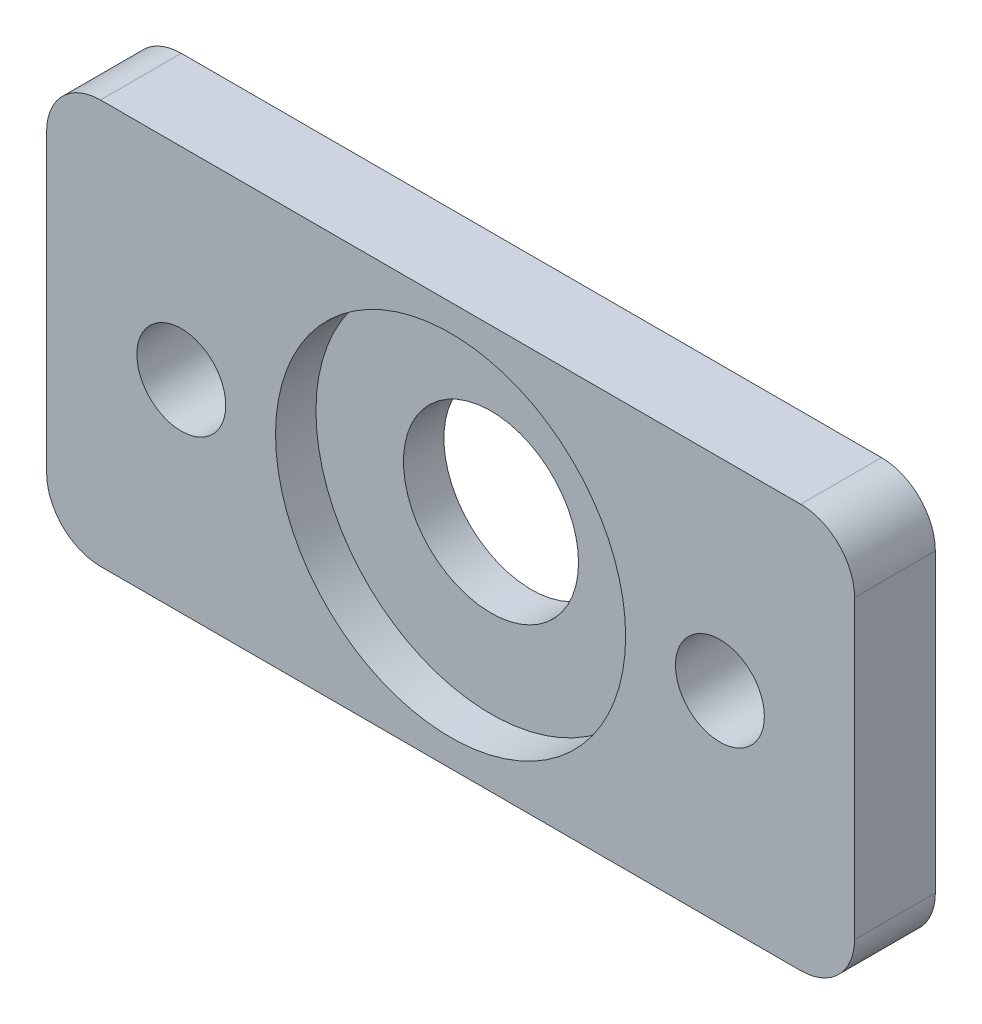
ISO-10303-21;
HEADER;
FILE_DESCRIPTION(('STEP AP214'),'2;1');
FILE_NAME('part.step','',(''),(''),'','','');
FILE_SCHEMA(('AUTOMOTIVE_DESIGN { 1 0 10303 214 1 1 1 1 }'));
ENDSEC;
DATA;
#1=APPLICATION_CONTEXT('core data for automotive mechanical design processes');
#2=APPLICATION_PROTOCOL_DEFINITION('international standard','automotive_design',2000,#1);
#3=PRODUCT_CONTEXT('',#1,'mechanical');
#4=PRODUCT('Part','Part','',(#3));
#5=PRODUCT_RELATED_PRODUCT_CATEGORY('part','',(#4));
#6=PRODUCT_DEFINITION_FORMATION('','',#4);
#7=PRODUCT_DEFINITION_CONTEXT('part definition',#1,'design');
#8=PRODUCT_DEFINITION('design','',#6,#7);
#9=PRODUCT_DEFINITION_SHAPE('','',#8);
#10=(LENGTH_UNIT() NAMED_UNIT(*) SI_UNIT(.MILLI.,.METRE.));
#11=(NAMED_UNIT(*) PLANE_ANGLE_UNIT() SI_UNIT($,.RADIAN.));
#12=(NAMED_UNIT(*) SI_UNIT($,.STERADIAN.) SOLID_ANGLE_UNIT());
#13=UNCERTAINTY_MEASURE_WITH_UNIT(LENGTH_MEASURE(1.E-05),#10,'distance_accuracy_value','');
#14=(GEOMETRIC_REPRESENTATION_CONTEXT(3) GLOBAL_UNCERTAINTY_ASSIGNED_CONTEXT((#13)) GLOBAL_UNIT_ASSIGNED_CONTEXT((#10,
#11,#12)) REPRESENTATION_CONTEXT('',''));
#15=CARTESIAN_POINT('',(0.,0.,0.));
#16=DIRECTION('',(0.,0.,1.));
#17=DIRECTION('',(1.,0.,0.));
#18=AXIS2_PLACEMENT_3D('',#15,#16,#17);
#19=CARTESIAN_POINT('',(28.,13.,3.));
#20=DIRECTION('',(0.,0.,-1.));
#21=DIRECTION('',(-1.,0.,0.));
#22=AXIS2_PLACEMENT_3D('',#19,#20,#21);
#23=CYLINDRICAL_SURFACE('',#22,2.);
#24=CARTESIAN_POINT('',(28.,13.,0.));
#25=DIRECTION('',(0.,0.,1.));
#26=DIRECTION('',(-1.,0.,0.));
#27=AXIS2_PLACEMENT_3D('',#24,#25,#26);
#28=CIRCLE('',#27,2.);
#29=CARTESIAN_POINT('',(30.,13.,0.));
#30=VERTEX_POINT('',#29);
#31=CARTESIAN_POINT('',(28.,15.,0.));
#32=VERTEX_POINT('',#31);
#33=EDGE_CURVE('E132',#30,#32,#28,.T.);
#34=ORIENTED_EDGE('',*,*,#33,.T.);
#35=DIRECTION('',(0.,0.,-1.));
#36=VECTOR('',#35,1.);
#37=CARTESIAN_POINT('',(28.,15.,3.));
#38=LINE('',#37,#36);
#39=CARTESIAN_POINT('',(28.,15.,3.));
#40=VERTEX_POINT('',#39);
#41=EDGE_CURVE('E11',#40,#32,#38,.T.);
#42=ORIENTED_EDGE('',*,*,#41,.F.);
#43=CARTESIAN_POINT('',(28.,13.,3.));
#44=DIRECTION('',(0.,0.,1.));
#45=DIRECTION('',(-1.,0.,0.));
#46=AXIS2_PLACEMENT_3D('',#43,#44,#45);
#47=CIRCLE('',#46,2.);
#48=CARTESIAN_POINT('',(30.,13.,3.));
#49=VERTEX_POINT('',#48);
#50=EDGE_CURVE('E147',#49,#40,#47,.T.);
#51=ORIENTED_EDGE('',*,*,#50,.F.);
#52=DIRECTION('',(0.,0.,-1.));
#53=VECTOR('',#52,1.);
#54=CARTESIAN_POINT('',(30.,13.,3.));
#55=LINE('',#54,#53);
#56=EDGE_CURVE('E128',#49,#30,#55,.T.);
#57=ORIENTED_EDGE('',*,*,#56,.T.);
#58=EDGE_LOOP('',(#34,#42,#51,#57));
#59=FACE_BOUND('',#58,.T.);
#60=ADVANCED_FACE('F35',(#59),#23,.T.);
#61=CARTESIAN_POINT('',(2.00000000000001,15.,3.));
#62=DIRECTION('',(0.,-1.,0.));
#63=DIRECTION('',(0.,0.,-1.));
#64=AXIS2_PLACEMENT_3D('',#61,#62,#63);
#65=PLANE('',#64);
#66=DIRECTION('',(-1.,0.,0.));
#67=VECTOR('',#66,1.);
#68=CARTESIAN_POINT('',(2.00000000000001,15.,0.));
#69=LINE('',#68,#67);
#70=CARTESIAN_POINT('',(2.00000000000001,15.,0.));
#71=VERTEX_POINT('',#70);
#72=EDGE_CURVE('E135',#32,#71,#69,.T.);
#73=ORIENTED_EDGE('',*,*,#72,.T.);
#74=DIRECTION('',(0.,0.,-1.));
#75=VECTOR('',#74,1.);
#76=CARTESIAN_POINT('',(2.00000000000001,15.,3.));
#77=LINE('',#76,#75);
#78=CARTESIAN_POINT('',(2.00000000000001,15.,3.));
#79=VERTEX_POINT('',#78);
#80=EDGE_CURVE('E44',#79,#71,#77,.T.);
#81=ORIENTED_EDGE('',*,*,#80,.F.);
#82=DIRECTION('',(-1.,0.,0.));
#83=VECTOR('',#82,1.);
#84=CARTESIAN_POINT('',(2.00000000000001,15.,3.));
#85=LINE('',#84,#83);
#86=EDGE_CURVE('E95',#40,#79,#85,.T.);
#87=ORIENTED_EDGE('',*,*,#86,.F.);
#88=ORIENTED_EDGE('',*,*,#41,.T.);
#89=EDGE_LOOP('',(#73,#81,#87,#88));
#90=FACE_BOUND('',#89,.T.);
#91=ADVANCED_FACE('F234',(#90),#65,.F.);
#92=CARTESIAN_POINT('',(2.,13.,3.));
#93=DIRECTION('',(0.,0.,-1.));
#94=DIRECTION('',(-1.,0.,0.));
#95=AXIS2_PLACEMENT_3D('',#92,#93,#94);
#96=CYLINDRICAL_SURFACE('',#95,2.);
#97=CARTESIAN_POINT('',(2.,13.,0.));
#98=DIRECTION('',(0.,0.,1.));
#99=DIRECTION('',(-1.,0.,0.));
#100=AXIS2_PLACEMENT_3D('',#97,#98,#99);
#101=CIRCLE('',#100,2.);
#102=CARTESIAN_POINT('',(0.,13.,0.));
#103=VERTEX_POINT('',#102);
#104=EDGE_CURVE('E138',#71,#103,#101,.T.);
#105=ORIENTED_EDGE('',*,*,#104,.T.);
#106=DIRECTION('',(0.,0.,-1.));
#107=VECTOR('',#106,1.);
#108=CARTESIAN_POINT('',(0.,13.,3.));
#109=LINE('',#108,#107);
#110=CARTESIAN_POINT('',(0.,13.,3.));
#111=VERTEX_POINT('',#110);
#112=EDGE_CURVE('E154',#111,#103,#109,.T.);
#113=ORIENTED_EDGE('',*,*,#112,.F.);
#114=CARTESIAN_POINT('',(2.,13.,3.));
#115=DIRECTION('',(0.,0.,1.));
#116=DIRECTION('',(-1.,0.,0.));
#117=AXIS2_PLACEMENT_3D('',#114,#115,#116);
#118=CIRCLE('',#117,2.);
#119=EDGE_CURVE('E163',#79,#111,#118,.T.);
#120=ORIENTED_EDGE('',*,*,#119,.F.);
#121=ORIENTED_EDGE('',*,*,#80,.T.);
#122=EDGE_LOOP('',(#105,#113,#120,#121));
#123=FACE_BOUND('',#122,.T.);
#124=ADVANCED_FACE('F161',(#123),#96,.T.);
#125=CARTESIAN_POINT('',(0.,2.00000000000001,3.));
#126=DIRECTION('',(1.,0.,0.));
#127=DIRECTION('',(0.,0.,-1.));
#128=AXIS2_PLACEMENT_3D('',#125,#126,#127);
#129=PLANE('',#128);
#130=DIRECTION('',(0.,-1.,0.));
#131=VECTOR('',#130,1.);
#132=CARTESIAN_POINT('',(0.,2.00000000000001,0.));
#133=LINE('',#132,#131);
#134=CARTESIAN_POINT('',(0.,2.00000000000001,0.));
#135=VERTEX_POINT('',#134);
#136=EDGE_CURVE('E140',#103,#135,#133,.T.);
#137=ORIENTED_EDGE('',*,*,#136,.T.);
#138=DIRECTION('',(0.,0.,-1.));
#139=VECTOR('',#138,1.);
#140=CARTESIAN_POINT('',(0.,2.00000000000001,3.));
#141=LINE('',#140,#139);
#142=CARTESIAN_POINT('',(0.,2.00000000000001,3.));
#143=VERTEX_POINT('',#142);
#144=EDGE_CURVE('E151',#143,#135,#141,.T.);
#145=ORIENTED_EDGE('',*,*,#144,.F.);
#146=DIRECTION('',(0.,-1.,0.));
#147=VECTOR('',#146,1.);
#148=CARTESIAN_POINT('',(0.,2.00000000000001,3.));
#149=LINE('',#148,#147);
#150=EDGE_CURVE('E175',#111,#143,#149,.T.);
#151=ORIENTED_EDGE('',*,*,#150,.F.);
#152=ORIENTED_EDGE('',*,*,#112,.T.);
#153=EDGE_LOOP('',(#137,#145,#151,#152));
#154=FACE_BOUND('',#153,.T.);
#155=ADVANCED_FACE('F171',(#154),#129,.F.);
#156=CARTESIAN_POINT('',(2.,2.,3.));
#157=DIRECTION('',(0.,0.,-1.));
#158=DIRECTION('',(-1.,0.,0.));
#159=AXIS2_PLACEMENT_3D('',#156,#157,#158);
#160=CYLINDRICAL_SURFACE('',#159,2.);
#161=CARTESIAN_POINT('',(2.,2.,0.));
#162=DIRECTION('',(0.,0.,1.));
#163=DIRECTION('',(-1.,0.,0.));
#164=AXIS2_PLACEMENT_3D('',#161,#162,#163);
#165=CIRCLE('',#164,2.);
#166=CARTESIAN_POINT('',(2.00000000000001,0.,0.));
#167=VERTEX_POINT('',#166);
#168=EDGE_CURVE('E142',#135,#167,#165,.T.);
#169=ORIENTED_EDGE('',*,*,#168,.T.);
#170=DIRECTION('',(0.,0.,-1.));
#171=VECTOR('',#170,1.);
#172=CARTESIAN_POINT('',(2.00000000000001,0.,3.));
#173=LINE('',#172,#171);
#174=CARTESIAN_POINT('',(2.00000000000001,0.,3.));
#175=VERTEX_POINT('',#174);
#176=EDGE_CURVE('E123',#175,#167,#173,.T.);
#177=ORIENTED_EDGE('',*,*,#176,.F.);
#178=CARTESIAN_POINT('',(2.,2.,3.));
#179=DIRECTION('',(0.,0.,1.));
#180=DIRECTION('',(-1.,0.,0.));
#181=AXIS2_PLACEMENT_3D('',#178,#179,#180);
#182=CIRCLE('',#181,2.);
#183=EDGE_CURVE('E114',#143,#175,#182,.T.);
#184=ORIENTED_EDGE('',*,*,#183,.F.);
#185=ORIENTED_EDGE('',*,*,#144,.T.);
#186=EDGE_LOOP('',(#169,#177,#184,#185));
#187=FACE_BOUND('',#186,.T.);
#188=ADVANCED_FACE('F174',(#187),#160,.T.);
#189=CARTESIAN_POINT('',(2.00000000000001,0.,3.));
#190=DIRECTION('',(0.,1.,0.));
#191=DIRECTION('',(0.,0.,1.));
#192=AXIS2_PLACEMENT_3D('',#189,#190,#191);
#193=PLANE('',#192);
#194=DIRECTION('',(1.,0.,0.));
#195=VECTOR('',#194,1.);
#196=CARTESIAN_POINT('',(2.00000000000001,0.,0.));
#197=LINE('',#196,#195);
#198=CARTESIAN_POINT('',(28.,0.,0.));
#199=VERTEX_POINT('',#198);
#200=EDGE_CURVE('E122',#167,#199,#197,.T.);
#201=ORIENTED_EDGE('',*,*,#200,.T.);
#202=DIRECTION('',(0.,0.,-1.));
#203=VECTOR('',#202,1.);
#204=CARTESIAN_POINT('',(28.,0.,3.));
#205=LINE('',#204,#203);
#206=CARTESIAN_POINT('',(28.,0.,3.));
#207=VERTEX_POINT('',#206);
#208=EDGE_CURVE('E119',#207,#199,#205,.T.);
#209=ORIENTED_EDGE('',*,*,#208,.F.);
#210=DIRECTION('',(1.,0.,0.));
#211=VECTOR('',#210,1.);
#212=CARTESIAN_POINT('',(2.00000000000001,0.,3.));
#213=LINE('',#212,#211);
#214=EDGE_CURVE('E108',#175,#207,#213,.T.);
#215=ORIENTED_EDGE('',*,*,#214,.F.);
#216=ORIENTED_EDGE('',*,*,#176,.T.);
#217=EDGE_LOOP('',(#201,#209,#215,#216));
#218=FACE_BOUND('',#217,.T.);
#219=ADVANCED_FACE('F120',(#218),#193,.F.);
#220=CARTESIAN_POINT('',(28.,2.,3.));
#221=DIRECTION('',(0.,0.,-1.));
#222=DIRECTION('',(-1.,0.,0.));
#223=AXIS2_PLACEMENT_3D('',#220,#221,#222);
#224=CYLINDRICAL_SURFACE('',#223,2.);
#225=CARTESIAN_POINT('',(28.,2.,0.));
#226=DIRECTION('',(0.,0.,1.));
#227=DIRECTION('',(1.,0.,0.));
#228=AXIS2_PLACEMENT_3D('',#225,#226,#227);
#229=CIRCLE('',#228,2.);
#230=CARTESIAN_POINT('',(30.,2.,0.));
#231=VERTEX_POINT('',#230);
#232=EDGE_CURVE('E81',#199,#231,#229,.T.);
#233=ORIENTED_EDGE('',*,*,#232,.T.);
#234=DIRECTION('',(0.,0.,-1.));
#235=VECTOR('',#234,1.);
#236=CARTESIAN_POINT('',(30.,2.,3.));
#237=LINE('',#236,#235);
#238=CARTESIAN_POINT('',(30.,2.,3.));
#239=VERTEX_POINT('',#238);
#240=EDGE_CURVE('E124',#239,#231,#237,.T.);
#241=ORIENTED_EDGE('',*,*,#240,.F.);
#242=CARTESIAN_POINT('',(28.,2.,3.));
#243=DIRECTION('',(0.,0.,1.));
#244=DIRECTION('',(1.,0.,0.));
#245=AXIS2_PLACEMENT_3D('',#242,#243,#244);
#246=CIRCLE('',#245,2.);
#247=EDGE_CURVE('E112',#207,#239,#246,.T.);
#248=ORIENTED_EDGE('',*,*,#247,.F.);
#249=ORIENTED_EDGE('',*,*,#208,.T.);
#250=EDGE_LOOP('',(#233,#241,#248,#249));
#251=FACE_BOUND('',#250,.T.);
#252=ADVANCED_FACE('F126',(#251),#224,.T.);
#253=CARTESIAN_POINT('',(30.,2.00000000000001,3.));
#254=DIRECTION('',(-1.,0.,0.));
#255=DIRECTION('',(0.,0.,1.));
#256=AXIS2_PLACEMENT_3D('',#253,#254,#255);
#257=PLANE('',#256);
#258=DIRECTION('',(0.,1.,0.));
#259=VECTOR('',#258,1.);
#260=CARTESIAN_POINT('',(30.,2.00000000000001,0.));
#261=LINE('',#260,#259);
#262=EDGE_CURVE('E87',#231,#30,#261,.T.);
#263=ORIENTED_EDGE('',*,*,#262,.T.);
#264=ORIENTED_EDGE('',*,*,#56,.F.);
#265=DIRECTION('',(0.,1.,0.));
#266=VECTOR('',#265,1.);
#267=CARTESIAN_POINT('',(30.,2.00000000000001,3.));
#268=LINE('',#267,#266);
#269=EDGE_CURVE('E52',#239,#49,#268,.T.);
#270=ORIENTED_EDGE('',*,*,#269,.F.);
#271=ORIENTED_EDGE('',*,*,#240,.T.);
#272=EDGE_LOOP('',(#263,#264,#270,#271));
#273=FACE_BOUND('',#272,.T.);
#274=ADVANCED_FACE('F213',(#273),#257,.F.);
#275=CARTESIAN_POINT('',(28.,13.,3.));
#276=DIRECTION('',(0.,0.,-1.));
#277=DIRECTION('',(-1.,0.,0.));
#278=AXIS2_PLACEMENT_3D('',#275,#276,#277);
#279=PLANE('',#278);
#280=CARTESIAN_POINT('',(5.,7.5,3.));
#281=DIRECTION('',(0.,0.,1.));
#282=DIRECTION('',(1.,0.,0.));
#283=AXIS2_PLACEMENT_3D('',#280,#281,#282);
#284=CIRCLE('',#283,1.65);
#285=CARTESIAN_POINT('',(6.65,7.5,3.));
#286=VERTEX_POINT('',#285);
#287=EDGE_CURVE('E196',#286,#286,#284,.T.);
#288=ORIENTED_EDGE('',*,*,#287,.F.);
#289=EDGE_LOOP('',(#288));
#290=FACE_BOUND('',#289,.T.);
#291=CARTESIAN_POINT('',(25.,7.5,3.));
#292=DIRECTION('',(0.,0.,1.));
#293=DIRECTION('',(1.,0.,0.));
#294=AXIS2_PLACEMENT_3D('',#291,#292,#293);
#295=CIRCLE('',#294,1.65);
#296=CARTESIAN_POINT('',(26.65,7.5,3.));
#297=VERTEX_POINT('',#296);
#298=EDGE_CURVE('E190',#297,#297,#295,.T.);
#299=ORIENTED_EDGE('',*,*,#298,.F.);
#300=EDGE_LOOP('',(#299));
#301=FACE_BOUND('',#300,.T.);
#302=CARTESIAN_POINT('',(15.,7.49999999999999,3.));
#303=DIRECTION('',(0.,0.,1.));
#304=DIRECTION('',(1.,0.,0.));
#305=AXIS2_PLACEMENT_3D('',#302,#303,#304);
#306=CIRCLE('',#305,6.5);
#307=CARTESIAN_POINT('',(21.5,7.49999999999999,3.));
#308=VERTEX_POINT('',#307);
#309=EDGE_CURVE('E181',#308,#308,#306,.T.);
#310=ORIENTED_EDGE('',*,*,#309,.F.);
#311=EDGE_LOOP('',(#310));
#312=FACE_BOUND('',#311,.T.);
#313=ORIENTED_EDGE('',*,*,#50,.T.);
#314=ORIENTED_EDGE('',*,*,#86,.T.);
#315=ORIENTED_EDGE('',*,*,#119,.T.);
#316=ORIENTED_EDGE('',*,*,#150,.T.);
#317=ORIENTED_EDGE('',*,*,#183,.T.);
#318=ORIENTED_EDGE('',*,*,#214,.T.);
#319=ORIENTED_EDGE('',*,*,#247,.T.);
#320=ORIENTED_EDGE('',*,*,#269,.T.);
#321=EDGE_LOOP('',(#313,#314,#315,#316,#317,#318,#319,#320));
#322=FACE_BOUND('',#321,.T.);
#323=ADVANCED_FACE('F110',(#290,#301,#312,#322),#279,.F.);
#324=CARTESIAN_POINT('',(28.,13.,0.));
#325=DIRECTION('',(0.,0.,-1.));
#326=DIRECTION('',(-1.,0.,0.));
#327=AXIS2_PLACEMENT_3D('',#324,#325,#326);
#328=PLANE('',#327);
#329=CARTESIAN_POINT('',(5.,7.5,0.));
#330=DIRECTION('',(0.,0.,1.));
#331=DIRECTION('',(1.,0.,0.));
#332=AXIS2_PLACEMENT_3D('',#329,#330,#331);
#333=CIRCLE('',#332,1.65);
#334=CARTESIAN_POINT('',(6.65,7.5,0.));
#335=VERTEX_POINT('',#334);
#336=EDGE_CURVE('E189',#335,#335,#333,.T.);
#337=ORIENTED_EDGE('',*,*,#336,.T.);
#338=EDGE_LOOP('',(#337));
#339=FACE_BOUND('',#338,.T.);
#340=CARTESIAN_POINT('',(25.,7.5,0.));
#341=DIRECTION('',(0.,0.,1.));
#342=DIRECTION('',(1.,0.,0.));
#343=AXIS2_PLACEMENT_3D('',#340,#341,#342);
#344=CIRCLE('',#343,1.65);
#345=CARTESIAN_POINT('',(26.65,7.5,0.));
#346=VERTEX_POINT('',#345);
#347=EDGE_CURVE('E193',#346,#346,#344,.T.);
#348=ORIENTED_EDGE('',*,*,#347,.T.);
#349=EDGE_LOOP('',(#348));
#350=FACE_BOUND('',#349,.T.);
#351=CARTESIAN_POINT('',(15.,7.49999999999999,0.));
#352=DIRECTION('',(0.,0.,1.));
#353=DIRECTION('',(1.,0.,0.));
#354=AXIS2_PLACEMENT_3D('',#351,#352,#353);
#355=CIRCLE('',#354,3.25);
#356=CARTESIAN_POINT('',(18.25,7.49999999999999,0.));
#357=VERTEX_POINT('',#356);
#358=EDGE_CURVE('E186',#357,#357,#355,.T.);
#359=ORIENTED_EDGE('',*,*,#358,.T.);
#360=EDGE_LOOP('',(#359));
#361=FACE_BOUND('',#360,.T.);
#362=ORIENTED_EDGE('',*,*,#33,.F.);
#363=ORIENTED_EDGE('',*,*,#262,.F.);
#364=ORIENTED_EDGE('',*,*,#232,.F.);
#365=ORIENTED_EDGE('',*,*,#200,.F.);
#366=ORIENTED_EDGE('',*,*,#168,.F.);
#367=ORIENTED_EDGE('',*,*,#136,.F.);
#368=ORIENTED_EDGE('',*,*,#104,.F.);
#369=ORIENTED_EDGE('',*,*,#72,.F.);
#370=EDGE_LOOP('',(#362,#363,#364,#365,#366,#367,#368,#369));
#371=FACE_BOUND('',#370,.T.);
#372=ADVANCED_FACE('F167',(#339,#350,#361,#371),#328,.T.);
#373=CARTESIAN_POINT('',(15.,7.49999999999999,1.5));
#374=DIRECTION('',(0.,0.,1.));
#375=DIRECTION('',(1.,0.,0.));
#376=AXIS2_PLACEMENT_3D('',#373,#374,#375);
#377=CYLINDRICAL_SURFACE('',#376,6.5);
#378=CARTESIAN_POINT('',(15.,7.49999999999999,1.5));
#379=DIRECTION('',(0.,0.,1.));
#380=DIRECTION('',(1.,0.,0.));
#381=AXIS2_PLACEMENT_3D('',#378,#379,#380);
#382=CIRCLE('',#381,6.5);
#383=CARTESIAN_POINT('',(21.5,7.49999999999999,1.5));
#384=VERTEX_POINT('',#383);
#385=EDGE_CURVE('E136',#384,#384,#382,.T.);
#386=ORIENTED_EDGE('',*,*,#385,.F.);
#387=EDGE_LOOP('',(#386));
#388=FACE_BOUND('',#387,.T.);
#389=ORIENTED_EDGE('',*,*,#309,.T.);
#390=EDGE_LOOP('',(#389));
#391=FACE_BOUND('',#390,.T.);
#392=ADVANCED_FACE('F219',(#388,#391),#377,.F.);
#393=CARTESIAN_POINT('',(15.,7.49999999999999,1.5));
#394=DIRECTION('',(0.,0.,1.));
#395=DIRECTION('',(1.,0.,0.));
#396=AXIS2_PLACEMENT_3D('',#393,#394,#395);
#397=PLANE('',#396);
#398=CARTESIAN_POINT('',(15.,7.49999999999999,1.5));
#399=DIRECTION('',(0.,0.,1.));
#400=DIRECTION('',(1.,0.,0.));
#401=AXIS2_PLACEMENT_3D('',#398,#399,#400);
#402=CIRCLE('',#401,3.25);
#403=CARTESIAN_POINT('',(18.25,7.49999999999999,1.5));
#404=VERTEX_POINT('',#403);
#405=EDGE_CURVE('E38',#404,#404,#402,.T.);
#406=ORIENTED_EDGE('',*,*,#405,.F.);
#407=EDGE_LOOP('',(#406));
#408=FACE_BOUND('',#407,.T.);
#409=ORIENTED_EDGE('',*,*,#385,.T.);
#410=EDGE_LOOP('',(#409));
#411=FACE_BOUND('',#410,.T.);
#412=ADVANCED_FACE('F221',(#408,#411),#397,.T.);
#413=CARTESIAN_POINT('',(15.,7.49999999999999,0.));
#414=DIRECTION('',(0.,0.,1.));
#415=DIRECTION('',(1.,0.,0.));
#416=AXIS2_PLACEMENT_3D('',#413,#414,#415);
#417=CYLINDRICAL_SURFACE('',#416,3.25);
#418=ORIENTED_EDGE('',*,*,#405,.T.);
#419=EDGE_LOOP('',(#418));
#420=FACE_BOUND('',#419,.T.);
#421=ORIENTED_EDGE('',*,*,#358,.F.);
#422=EDGE_LOOP('',(#421));
#423=FACE_BOUND('',#422,.T.);
#424=ADVANCED_FACE('F228',(#420,#423),#417,.F.);
#425=CARTESIAN_POINT('',(25.,7.5,0.));
#426=DIRECTION('',(0.,0.,1.));
#427=DIRECTION('',(1.,0.,0.));
#428=AXIS2_PLACEMENT_3D('',#425,#426,#427);
#429=CYLINDRICAL_SURFACE('',#428,1.65);
#430=ORIENTED_EDGE('',*,*,#347,.F.);
#431=EDGE_LOOP('',(#430));
#432=FACE_BOUND('',#431,.T.);
#433=ORIENTED_EDGE('',*,*,#298,.T.);
#434=EDGE_LOOP('',(#433));
#435=FACE_BOUND('',#434,.T.);
#436=ADVANCED_FACE('F207',(#432,#435),#429,.F.);
#437=CARTESIAN_POINT('',(5.,7.5,0.));
#438=DIRECTION('',(0.,0.,1.));
#439=DIRECTION('',(1.,0.,0.));
#440=AXIS2_PLACEMENT_3D('',#437,#438,#439);
#441=CYLINDRICAL_SURFACE('',#440,1.65);
#442=ORIENTED_EDGE('',*,*,#336,.F.);
#443=EDGE_LOOP('',(#442));
#444=FACE_BOUND('',#443,.T.);
#445=ORIENTED_EDGE('',*,*,#287,.T.);
#446=EDGE_LOOP('',(#445));
#447=FACE_BOUND('',#446,.T.);
#448=ADVANCED_FACE('F204',(#444,#447),#441,.F.);
#449=CLOSED_SHELL('',(#60,#91,#124,#155,#188,#219,#252,#274,#323,#372,#392,#412,#424,#436,#448));
#450=MANIFOLD_SOLID_BREP('B2',#449);
#451=ADVANCED_BREP_SHAPE_REPRESENTATION('',(#18,#450),#14);
#452=SHAPE_DEFINITION_REPRESENTATION(#9,#451);
ENDSEC;
END-ISO-10303-21;
